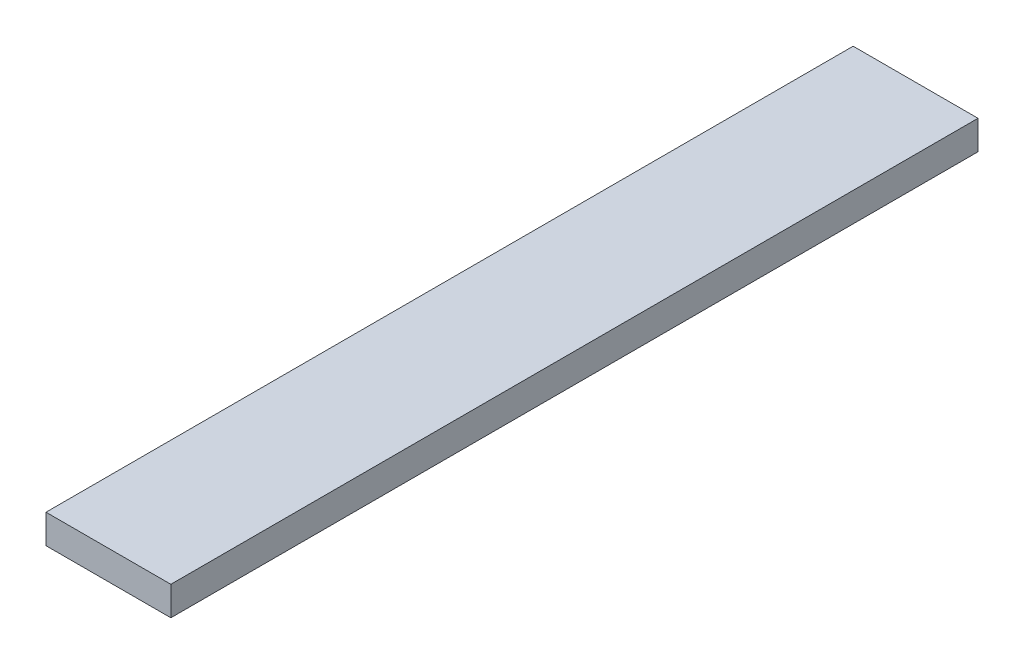
ISO-10303-21;
HEADER;
FILE_DESCRIPTION(('STEP AP214'),'2;1');
FILE_NAME('part.step','',(''),(''),'','','');
FILE_SCHEMA(('AUTOMOTIVE_DESIGN { 1 0 10303 214 1 1 1 1 }'));
ENDSEC;
DATA;
#1=APPLICATION_CONTEXT('core data for automotive mechanical design processes');
#2=APPLICATION_PROTOCOL_DEFINITION('international standard','automotive_design',2000,#1);
#3=PRODUCT_CONTEXT('',#1,'mechanical');
#4=PRODUCT('Part','Part','',(#3));
#5=PRODUCT_RELATED_PRODUCT_CATEGORY('part','',(#4));
#6=PRODUCT_DEFINITION_FORMATION('','',#4);
#7=PRODUCT_DEFINITION_CONTEXT('part definition',#1,'design');
#8=PRODUCT_DEFINITION('design','',#6,#7);
#9=PRODUCT_DEFINITION_SHAPE('','',#8);
#10=(LENGTH_UNIT() NAMED_UNIT(*) SI_UNIT(.MILLI.,.METRE.));
#11=(NAMED_UNIT(*) PLANE_ANGLE_UNIT() SI_UNIT($,.RADIAN.));
#12=(NAMED_UNIT(*) SI_UNIT($,.STERADIAN.) SOLID_ANGLE_UNIT());
#13=UNCERTAINTY_MEASURE_WITH_UNIT(LENGTH_MEASURE(1.E-05),#10,'distance_accuracy_value','');
#14=(GEOMETRIC_REPRESENTATION_CONTEXT(3) GLOBAL_UNCERTAINTY_ASSIGNED_CONTEXT((#13)) GLOBAL_UNIT_ASSIGNED_CONTEXT((#10,
#11,#12)) REPRESENTATION_CONTEXT('',''));
#15=CARTESIAN_POINT('',(0.,0.,0.));
#16=DIRECTION('',(0.,0.,1.));
#17=DIRECTION('',(1.,0.,0.));
#18=AXIS2_PLACEMENT_3D('',#15,#16,#17);
#19=CARTESIAN_POINT('',(25.4,11.81,-164.21));
#20=DIRECTION('',(-1.,0.,0.));
#21=DIRECTION('',(0.,0.,1.));
#22=AXIS2_PLACEMENT_3D('',#19,#20,#21);
#23=PLANE('',#22);
#24=DIRECTION('',(0.,0.,-1.));
#25=VECTOR('',#24,1.);
#26=CARTESIAN_POINT('',(25.4,0.,-164.21));
#27=LINE('',#26,#25);
#28=CARTESIAN_POINT('',(25.4,0.,164.21));
#29=VERTEX_POINT('',#28);
#30=CARTESIAN_POINT('',(25.4,0.,-164.21));
#31=VERTEX_POINT('',#30);
#32=EDGE_CURVE('E97',#29,#31,#27,.T.);
#33=ORIENTED_EDGE('',*,*,#32,.T.);
#34=DIRECTION('',(0.,-1.,0.));
#35=VECTOR('',#34,1.);
#36=CARTESIAN_POINT('',(25.4,11.81,-164.21));
#37=LINE('',#36,#35);
#38=CARTESIAN_POINT('',(25.4,11.81,-164.21));
#39=VERTEX_POINT('',#38);
#40=EDGE_CURVE('E11',#39,#31,#37,.T.);
#41=ORIENTED_EDGE('',*,*,#40,.F.);
#42=DIRECTION('',(0.,0.,-1.));
#43=VECTOR('',#42,1.);
#44=CARTESIAN_POINT('',(25.4,11.81,-164.21));
#45=LINE('',#44,#43);
#46=CARTESIAN_POINT('',(25.4,11.81,164.21));
#47=VERTEX_POINT('',#46);
#48=EDGE_CURVE('E85',#47,#39,#45,.T.);
#49=ORIENTED_EDGE('',*,*,#48,.F.);
#50=DIRECTION('',(0.,-1.,0.));
#51=VECTOR('',#50,1.);
#52=CARTESIAN_POINT('',(25.4,11.81,164.21));
#53=LINE('',#52,#51);
#54=EDGE_CURVE('E93',#47,#29,#53,.T.);
#55=ORIENTED_EDGE('',*,*,#54,.T.);
#56=EDGE_LOOP('',(#33,#41,#49,#55));
#57=FACE_BOUND('',#56,.T.);
#58=ADVANCED_FACE('F34',(#57),#23,.F.);
#59=CARTESIAN_POINT('',(-25.4,11.81,-164.21));
#60=DIRECTION('',(0.,0.,1.));
#61=DIRECTION('',(1.,0.,0.));
#62=AXIS2_PLACEMENT_3D('',#59,#60,#61);
#63=PLANE('',#62);
#64=DIRECTION('',(-1.,0.,0.));
#65=VECTOR('',#64,1.);
#66=CARTESIAN_POINT('',(-25.4,0.,-164.21));
#67=LINE('',#66,#65);
#68=CARTESIAN_POINT('',(-25.4,0.,-164.21));
#69=VERTEX_POINT('',#68);
#70=EDGE_CURVE('E89',#31,#69,#67,.T.);
#71=ORIENTED_EDGE('',*,*,#70,.T.);
#72=DIRECTION('',(0.,-1.,0.));
#73=VECTOR('',#72,1.);
#74=CARTESIAN_POINT('',(-25.4,11.81,-164.21));
#75=LINE('',#74,#73);
#76=CARTESIAN_POINT('',(-25.4,11.81,-164.21));
#77=VERTEX_POINT('',#76);
#78=EDGE_CURVE('E42',#77,#69,#75,.T.);
#79=ORIENTED_EDGE('',*,*,#78,.F.);
#80=DIRECTION('',(-1.,0.,0.));
#81=VECTOR('',#80,1.);
#82=CARTESIAN_POINT('',(-25.4,11.81,-164.21));
#83=LINE('',#82,#81);
#84=EDGE_CURVE('E80',#39,#77,#83,.T.);
#85=ORIENTED_EDGE('',*,*,#84,.F.);
#86=ORIENTED_EDGE('',*,*,#40,.T.);
#87=EDGE_LOOP('',(#71,#79,#85,#86));
#88=FACE_BOUND('',#87,.T.);
#89=ADVANCED_FACE('F88',(#88),#63,.F.);
#90=CARTESIAN_POINT('',(-25.4,11.81,-164.21));
#91=DIRECTION('',(1.,0.,0.));
#92=DIRECTION('',(0.,0.,-1.));
#93=AXIS2_PLACEMENT_3D('',#90,#91,#92);
#94=PLANE('',#93);
#95=DIRECTION('',(0.,0.,1.));
#96=VECTOR('',#95,1.);
#97=CARTESIAN_POINT('',(-25.4,0.,-164.21));
#98=LINE('',#97,#96);
#99=CARTESIAN_POINT('',(-25.4,0.,164.21));
#100=VERTEX_POINT('',#99);
#101=EDGE_CURVE('E67',#69,#100,#98,.T.);
#102=ORIENTED_EDGE('',*,*,#101,.T.);
#103=DIRECTION('',(0.,-1.,0.));
#104=VECTOR('',#103,1.);
#105=CARTESIAN_POINT('',(-25.4,11.81,164.21));
#106=LINE('',#105,#104);
#107=CARTESIAN_POINT('',(-25.4,11.81,164.21));
#108=VERTEX_POINT('',#107);
#109=EDGE_CURVE('E90',#108,#100,#106,.T.);
#110=ORIENTED_EDGE('',*,*,#109,.F.);
#111=DIRECTION('',(0.,0.,1.));
#112=VECTOR('',#111,1.);
#113=CARTESIAN_POINT('',(-25.4,11.81,-164.21));
#114=LINE('',#113,#112);
#115=EDGE_CURVE('E83',#77,#108,#114,.T.);
#116=ORIENTED_EDGE('',*,*,#115,.F.);
#117=ORIENTED_EDGE('',*,*,#78,.T.);
#118=EDGE_LOOP('',(#102,#110,#116,#117));
#119=FACE_BOUND('',#118,.T.);
#120=ADVANCED_FACE('F91',(#119),#94,.F.);
#121=CARTESIAN_POINT('',(-25.4,11.81,164.21));
#122=DIRECTION('',(0.,0.,-1.));
#123=DIRECTION('',(-1.,0.,0.));
#124=AXIS2_PLACEMENT_3D('',#121,#122,#123);
#125=PLANE('',#124);
#126=DIRECTION('',(1.,0.,0.));
#127=VECTOR('',#126,1.);
#128=CARTESIAN_POINT('',(-25.4,0.,164.21));
#129=LINE('',#128,#127);
#130=EDGE_CURVE('E73',#100,#29,#129,.T.);
#131=ORIENTED_EDGE('',*,*,#130,.T.);
#132=ORIENTED_EDGE('',*,*,#54,.F.);
#133=DIRECTION('',(1.,0.,0.));
#134=VECTOR('',#133,1.);
#135=CARTESIAN_POINT('',(-25.4,11.81,164.21));
#136=LINE('',#135,#134);
#137=EDGE_CURVE('E50',#108,#47,#136,.T.);
#138=ORIENTED_EDGE('',*,*,#137,.F.);
#139=ORIENTED_EDGE('',*,*,#109,.T.);
#140=EDGE_LOOP('',(#131,#132,#138,#139));
#141=FACE_BOUND('',#140,.T.);
#142=ADVANCED_FACE('F104',(#141),#125,.F.);
#143=CARTESIAN_POINT('',(0.,11.81,0.));
#144=DIRECTION('',(0.,1.,0.));
#145=DIRECTION('',(0.,0.,1.));
#146=AXIS2_PLACEMENT_3D('',#143,#144,#145);
#147=PLANE('',#146);
#148=ORIENTED_EDGE('',*,*,#48,.T.);
#149=ORIENTED_EDGE('',*,*,#84,.T.);
#150=ORIENTED_EDGE('',*,*,#115,.T.);
#151=ORIENTED_EDGE('',*,*,#137,.T.);
#152=EDGE_LOOP('',(#148,#149,#150,#151));
#153=FACE_BOUND('',#152,.T.);
#154=ADVANCED_FACE('F81',(#153),#147,.T.);
#155=CARTESIAN_POINT('',(0.,0.,0.));
#156=DIRECTION('',(0.,1.,0.));
#157=DIRECTION('',(0.,0.,1.));
#158=AXIS2_PLACEMENT_3D('',#155,#156,#157);
#159=PLANE('',#158);
#160=ORIENTED_EDGE('',*,*,#32,.F.);
#161=ORIENTED_EDGE('',*,*,#130,.F.);
#162=ORIENTED_EDGE('',*,*,#101,.F.);
#163=ORIENTED_EDGE('',*,*,#70,.F.);
#164=EDGE_LOOP('',(#160,#161,#162,#163));
#165=FACE_BOUND('',#164,.T.);
#166=ADVANCED_FACE('F107',(#165),#159,.F.);
#167=CLOSED_SHELL('',(#58,#89,#120,#142,#154,#166));
#168=MANIFOLD_SOLID_BREP('B2',#167);
#169=ADVANCED_BREP_SHAPE_REPRESENTATION('',(#18,#168),#14);
#170=SHAPE_DEFINITION_REPRESENTATION(#9,#169);
ENDSEC;
END-ISO-10303-21;
